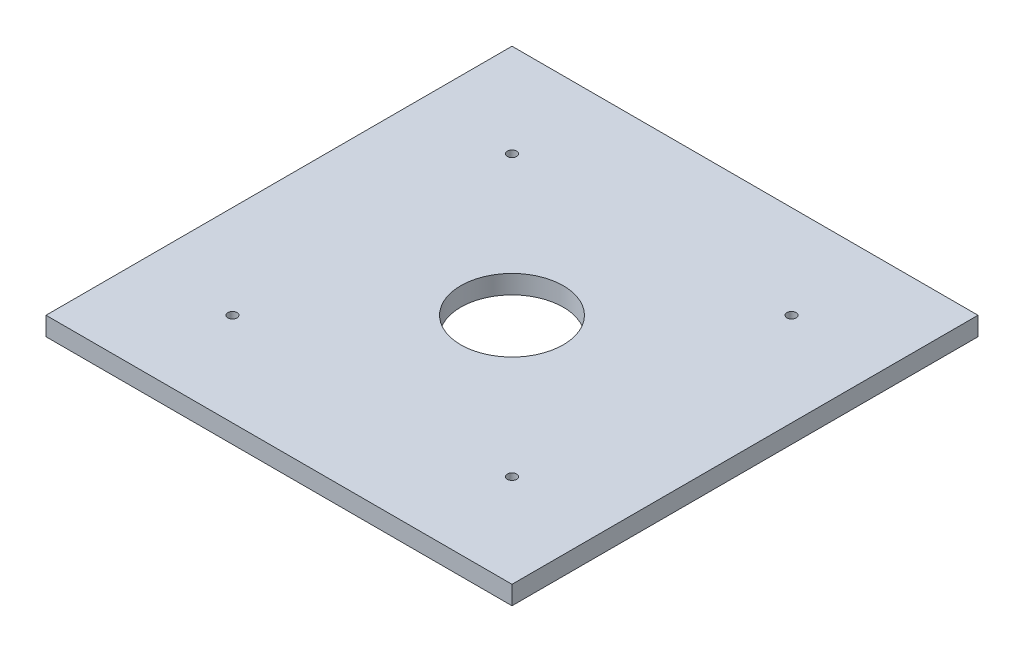
ISO-10303-21;
HEADER;
FILE_DESCRIPTION(('STEP AP214'),'2;1');
FILE_NAME('part.step','',(''),(''),'','','');
FILE_SCHEMA(('AUTOMOTIVE_DESIGN { 1 0 10303 214 1 1 1 1 }'));
ENDSEC;
DATA;
#1=APPLICATION_CONTEXT('core data for automotive mechanical design processes');
#2=APPLICATION_PROTOCOL_DEFINITION('international standard','automotive_design',2000,#1);
#3=PRODUCT_CONTEXT('',#1,'mechanical');
#4=PRODUCT('Part','Part','',(#3));
#5=PRODUCT_RELATED_PRODUCT_CATEGORY('part','',(#4));
#6=PRODUCT_DEFINITION_FORMATION('','',#4);
#7=PRODUCT_DEFINITION_CONTEXT('part definition',#1,'design');
#8=PRODUCT_DEFINITION('design','',#6,#7);
#9=PRODUCT_DEFINITION_SHAPE('','',#8);
#10=(LENGTH_UNIT() NAMED_UNIT(*) SI_UNIT(.MILLI.,.METRE.));
#11=(NAMED_UNIT(*) PLANE_ANGLE_UNIT() SI_UNIT($,.RADIAN.));
#12=(NAMED_UNIT(*) SI_UNIT($,.STERADIAN.) SOLID_ANGLE_UNIT());
#13=UNCERTAINTY_MEASURE_WITH_UNIT(LENGTH_MEASURE(1.E-05),#10,'distance_accuracy_value','');
#14=(GEOMETRIC_REPRESENTATION_CONTEXT(3) GLOBAL_UNCERTAINTY_ASSIGNED_CONTEXT((#13)) GLOBAL_UNIT_ASSIGNED_CONTEXT((#10,
#11,#12)) REPRESENTATION_CONTEXT('',''));
#15=CARTESIAN_POINT('',(0.,0.,0.));
#16=DIRECTION('',(0.,0.,1.));
#17=DIRECTION('',(1.,0.,0.));
#18=AXIS2_PLACEMENT_3D('',#15,#16,#17);
#19=CARTESIAN_POINT('',(0.,10.,0.));
#20=DIRECTION('',(0.,-1.,0.));
#21=DIRECTION('',(0.,0.,-1.));
#22=AXIS2_PLACEMENT_3D('',#19,#20,#21);
#23=PLANE('',#22);
#24=DIRECTION('',(0.,0.,-1.));
#25=VECTOR('',#24,1.);
#26=CARTESIAN_POINT('',(250.,10.,250.));
#27=LINE('',#26,#25);
#28=CARTESIAN_POINT('',(250.,10.,250.));
#29=VERTEX_POINT('',#28);
#30=CARTESIAN_POINT('',(250.,10.,-250.));
#31=VERTEX_POINT('',#30);
#32=EDGE_CURVE('E89',#29,#31,#27,.T.);
#33=ORIENTED_EDGE('',*,*,#32,.T.);
#34=DIRECTION('',(-1.,0.,0.));
#35=VECTOR('',#34,1.);
#36=CARTESIAN_POINT('',(-250.,10.,-250.));
#37=LINE('',#36,#35);
#38=CARTESIAN_POINT('',(-250.,10.,-250.));
#39=VERTEX_POINT('',#38);
#40=EDGE_CURVE('E84',#31,#39,#37,.T.);
#41=ORIENTED_EDGE('',*,*,#40,.T.);
#42=DIRECTION('',(0.,0.,1.));
#43=VECTOR('',#42,1.);
#44=CARTESIAN_POINT('',(-250.,10.,250.));
#45=LINE('',#44,#43);
#46=CARTESIAN_POINT('',(-250.,10.,250.));
#47=VERTEX_POINT('',#46);
#48=EDGE_CURVE('E87',#39,#47,#45,.T.);
#49=ORIENTED_EDGE('',*,*,#48,.T.);
#50=DIRECTION('',(1.,0.,0.));
#51=VECTOR('',#50,1.);
#52=CARTESIAN_POINT('',(-250.,10.,250.));
#53=LINE('',#52,#51);
#54=EDGE_CURVE('E54',#47,#29,#53,.T.);
#55=ORIENTED_EDGE('',*,*,#54,.T.);
#56=EDGE_LOOP('',(#33,#41,#49,#55));
#57=FACE_BOUND('',#56,.T.);
#58=CARTESIAN_POINT('',(-2.22044604925031E-13,10.,0.));
#59=DIRECTION('',(0.,1.,0.));
#60=DIRECTION('',(0.,0.,1.));
#61=AXIS2_PLACEMENT_3D('',#58,#59,#60);
#62=CIRCLE('',#61,55.);
#63=CARTESIAN_POINT('',(-2.22044604925031E-13,10.,54.9999999999999));
#64=VERTEX_POINT('',#63);
#65=EDGE_CURVE('E104',#64,#64,#62,.T.);
#66=ORIENTED_EDGE('',*,*,#65,.F.);
#67=EDGE_LOOP('',(#66));
#68=FACE_BOUND('',#67,.T.);
#69=CARTESIAN_POINT('',(-150.,10.,-150.));
#70=DIRECTION('',(0.,1.,0.));
#71=DIRECTION('',(0.,0.,1.));
#72=AXIS2_PLACEMENT_3D('',#69,#70,#71);
#73=CIRCLE('',#72,4.99999999999999);
#74=CARTESIAN_POINT('',(-150.,10.,-145.));
#75=VERTEX_POINT('',#74);
#76=EDGE_CURVE('E119',#75,#75,#73,.T.);
#77=ORIENTED_EDGE('',*,*,#76,.F.);
#78=EDGE_LOOP('',(#77));
#79=FACE_BOUND('',#78,.T.);
#80=CARTESIAN_POINT('',(150.,10.,-150.));
#81=DIRECTION('',(0.,1.,0.));
#82=DIRECTION('',(0.,0.,1.));
#83=AXIS2_PLACEMENT_3D('',#80,#81,#82);
#84=CIRCLE('',#83,4.99999999999999);
#85=CARTESIAN_POINT('',(150.,10.,-145.));
#86=VERTEX_POINT('',#85);
#87=EDGE_CURVE('E125',#86,#86,#84,.T.);
#88=ORIENTED_EDGE('',*,*,#87,.F.);
#89=EDGE_LOOP('',(#88));
#90=FACE_BOUND('',#89,.T.);
#91=CARTESIAN_POINT('',(-150.,10.,150.));
#92=DIRECTION('',(0.,1.,0.));
#93=DIRECTION('',(0.,0.,1.));
#94=AXIS2_PLACEMENT_3D('',#91,#92,#93);
#95=CIRCLE('',#94,4.99999999999999);
#96=CARTESIAN_POINT('',(-150.,10.,155.));
#97=VERTEX_POINT('',#96);
#98=EDGE_CURVE('E131',#97,#97,#95,.T.);
#99=ORIENTED_EDGE('',*,*,#98,.F.);
#100=EDGE_LOOP('',(#99));
#101=FACE_BOUND('',#100,.T.);
#102=CARTESIAN_POINT('',(150.,10.,150.));
#103=DIRECTION('',(0.,1.,0.));
#104=DIRECTION('',(0.,0.,1.));
#105=AXIS2_PLACEMENT_3D('',#102,#103,#104);
#106=CIRCLE('',#105,4.99999999999999);
#107=CARTESIAN_POINT('',(150.,10.,155.));
#108=VERTEX_POINT('',#107);
#109=EDGE_CURVE('E137',#108,#108,#106,.T.);
#110=ORIENTED_EDGE('',*,*,#109,.F.);
#111=EDGE_LOOP('',(#110));
#112=FACE_BOUND('',#111,.T.);
#113=ADVANCED_FACE('F37',(#57,#68,#79,#90,#101,#112),#23,.F.);
#114=CARTESIAN_POINT('',(0.,-10.,0.));
#115=DIRECTION('',(0.,-1.,0.));
#116=DIRECTION('',(0.,0.,-1.));
#117=AXIS2_PLACEMENT_3D('',#114,#115,#116);
#118=PLANE('',#117);
#119=CARTESIAN_POINT('',(-150.,-10.,150.));
#120=DIRECTION('',(0.,1.,0.));
#121=DIRECTION('',(0.,0.,1.));
#122=AXIS2_PLACEMENT_3D('',#119,#120,#121);
#123=CIRCLE('',#122,4.99999999999999);
#124=CARTESIAN_POINT('',(-150.,-10.,155.));
#125=VERTEX_POINT('',#124);
#126=EDGE_CURVE('E134',#125,#125,#123,.T.);
#127=ORIENTED_EDGE('',*,*,#126,.T.);
#128=EDGE_LOOP('',(#127));
#129=FACE_BOUND('',#128,.T.);
#130=CARTESIAN_POINT('',(-150.,-10.,-150.));
#131=DIRECTION('',(0.,1.,0.));
#132=DIRECTION('',(0.,0.,1.));
#133=AXIS2_PLACEMENT_3D('',#130,#131,#132);
#134=CIRCLE('',#133,4.99999999999999);
#135=CARTESIAN_POINT('',(-150.,-10.,-145.));
#136=VERTEX_POINT('',#135);
#137=EDGE_CURVE('E122',#136,#136,#134,.T.);
#138=ORIENTED_EDGE('',*,*,#137,.T.);
#139=EDGE_LOOP('',(#138));
#140=FACE_BOUND('',#139,.T.);
#141=DIRECTION('',(0.,0.,-1.));
#142=VECTOR('',#141,1.);
#143=CARTESIAN_POINT('',(250.,-10.,250.));
#144=LINE('',#143,#142);
#145=CARTESIAN_POINT('',(250.,-10.,250.));
#146=VERTEX_POINT('',#145);
#147=CARTESIAN_POINT('',(250.,-10.,-250.));
#148=VERTEX_POINT('',#147);
#149=EDGE_CURVE('E101',#146,#148,#144,.T.);
#150=ORIENTED_EDGE('',*,*,#149,.F.);
#151=DIRECTION('',(1.,0.,0.));
#152=VECTOR('',#151,1.);
#153=CARTESIAN_POINT('',(-250.,-10.,250.));
#154=LINE('',#153,#152);
#155=CARTESIAN_POINT('',(-250.,-10.,250.));
#156=VERTEX_POINT('',#155);
#157=EDGE_CURVE('E77',#156,#146,#154,.T.);
#158=ORIENTED_EDGE('',*,*,#157,.F.);
#159=DIRECTION('',(0.,0.,1.));
#160=VECTOR('',#159,1.);
#161=CARTESIAN_POINT('',(-250.,-10.,250.));
#162=LINE('',#161,#160);
#163=CARTESIAN_POINT('',(-250.,-10.,-250.));
#164=VERTEX_POINT('',#163);
#165=EDGE_CURVE('E71',#164,#156,#162,.T.);
#166=ORIENTED_EDGE('',*,*,#165,.F.);
#167=DIRECTION('',(-1.,0.,0.));
#168=VECTOR('',#167,1.);
#169=CARTESIAN_POINT('',(-250.,-10.,-250.));
#170=LINE('',#169,#168);
#171=EDGE_CURVE('E93',#148,#164,#170,.T.);
#172=ORIENTED_EDGE('',*,*,#171,.F.);
#173=EDGE_LOOP('',(#150,#158,#166,#172));
#174=FACE_BOUND('',#173,.T.);
#175=CARTESIAN_POINT('',(-2.22044604925031E-13,-10.,0.));
#176=DIRECTION('',(0.,1.,0.));
#177=DIRECTION('',(0.,0.,1.));
#178=AXIS2_PLACEMENT_3D('',#175,#176,#177);
#179=CIRCLE('',#178,55.);
#180=CARTESIAN_POINT('',(-2.22044604925031E-13,-10.,54.9999999999999));
#181=VERTEX_POINT('',#180);
#182=EDGE_CURVE('E116',#181,#181,#179,.T.);
#183=ORIENTED_EDGE('',*,*,#182,.T.);
#184=EDGE_LOOP('',(#183));
#185=FACE_BOUND('',#184,.T.);
#186=CARTESIAN_POINT('',(150.,-10.,-150.));
#187=DIRECTION('',(0.,1.,0.));
#188=DIRECTION('',(0.,0.,1.));
#189=AXIS2_PLACEMENT_3D('',#186,#187,#188);
#190=CIRCLE('',#189,4.99999999999999);
#191=CARTESIAN_POINT('',(150.,-10.,-145.));
#192=VERTEX_POINT('',#191);
#193=EDGE_CURVE('E128',#192,#192,#190,.T.);
#194=ORIENTED_EDGE('',*,*,#193,.T.);
#195=EDGE_LOOP('',(#194));
#196=FACE_BOUND('',#195,.T.);
#197=CARTESIAN_POINT('',(150.,-10.,150.));
#198=DIRECTION('',(0.,1.,0.));
#199=DIRECTION('',(0.,0.,1.));
#200=AXIS2_PLACEMENT_3D('',#197,#198,#199);
#201=CIRCLE('',#200,4.99999999999999);
#202=CARTESIAN_POINT('',(150.,-10.,155.));
#203=VERTEX_POINT('',#202);
#204=EDGE_CURVE('E140',#203,#203,#201,.T.);
#205=ORIENTED_EDGE('',*,*,#204,.T.);
#206=EDGE_LOOP('',(#205));
#207=FACE_BOUND('',#206,.T.);
#208=ADVANCED_FACE('F112',(#129,#140,#174,#185,#196,#207),#118,.T.);
#209=CARTESIAN_POINT('',(250.,10.,250.));
#210=DIRECTION('',(-1.,0.,0.));
#211=DIRECTION('',(0.,0.,1.));
#212=AXIS2_PLACEMENT_3D('',#209,#210,#211);
#213=PLANE('',#212);
#214=ORIENTED_EDGE('',*,*,#149,.T.);
#215=DIRECTION('',(0.,-1.,0.));
#216=VECTOR('',#215,1.);
#217=CARTESIAN_POINT('',(250.,10.,-250.));
#218=LINE('',#217,#216);
#219=EDGE_CURVE('E11',#31,#148,#218,.T.);
#220=ORIENTED_EDGE('',*,*,#219,.F.);
#221=ORIENTED_EDGE('',*,*,#32,.F.);
#222=DIRECTION('',(0.,-1.,0.));
#223=VECTOR('',#222,1.);
#224=CARTESIAN_POINT('',(250.,10.,250.));
#225=LINE('',#224,#223);
#226=EDGE_CURVE('E97',#29,#146,#225,.T.);
#227=ORIENTED_EDGE('',*,*,#226,.T.);
#228=EDGE_LOOP('',(#214,#220,#221,#227));
#229=FACE_BOUND('',#228,.T.);
#230=ADVANCED_FACE('F39',(#229),#213,.F.);
#231=CARTESIAN_POINT('',(-250.,10.,-250.));
#232=DIRECTION('',(0.,0.,1.));
#233=DIRECTION('',(1.,0.,0.));
#234=AXIS2_PLACEMENT_3D('',#231,#232,#233);
#235=PLANE('',#234);
#236=ORIENTED_EDGE('',*,*,#171,.T.);
#237=DIRECTION('',(0.,-1.,0.));
#238=VECTOR('',#237,1.);
#239=CARTESIAN_POINT('',(-250.,10.,-250.));
#240=LINE('',#239,#238);
#241=EDGE_CURVE('E46',#39,#164,#240,.T.);
#242=ORIENTED_EDGE('',*,*,#241,.F.);
#243=ORIENTED_EDGE('',*,*,#40,.F.);
#244=ORIENTED_EDGE('',*,*,#219,.T.);
#245=EDGE_LOOP('',(#236,#242,#243,#244));
#246=FACE_BOUND('',#245,.T.);
#247=ADVANCED_FACE('F92',(#246),#235,.F.);
#248=CARTESIAN_POINT('',(-250.,10.,250.));
#249=DIRECTION('',(1.,0.,0.));
#250=DIRECTION('',(0.,0.,-1.));
#251=AXIS2_PLACEMENT_3D('',#248,#249,#250);
#252=PLANE('',#251);
#253=ORIENTED_EDGE('',*,*,#165,.T.);
#254=DIRECTION('',(0.,-1.,0.));
#255=VECTOR('',#254,1.);
#256=CARTESIAN_POINT('',(-250.,10.,250.));
#257=LINE('',#256,#255);
#258=EDGE_CURVE('E94',#47,#156,#257,.T.);
#259=ORIENTED_EDGE('',*,*,#258,.F.);
#260=ORIENTED_EDGE('',*,*,#48,.F.);
#261=ORIENTED_EDGE('',*,*,#241,.T.);
#262=EDGE_LOOP('',(#253,#259,#260,#261));
#263=FACE_BOUND('',#262,.T.);
#264=ADVANCED_FACE('F95',(#263),#252,.F.);
#265=CARTESIAN_POINT('',(-250.,10.,250.));
#266=DIRECTION('',(0.,0.,-1.));
#267=DIRECTION('',(-1.,0.,0.));
#268=AXIS2_PLACEMENT_3D('',#265,#266,#267);
#269=PLANE('',#268);
#270=ORIENTED_EDGE('',*,*,#157,.T.);
#271=ORIENTED_EDGE('',*,*,#226,.F.);
#272=ORIENTED_EDGE('',*,*,#54,.F.);
#273=ORIENTED_EDGE('',*,*,#258,.T.);
#274=EDGE_LOOP('',(#270,#271,#272,#273));
#275=FACE_BOUND('',#274,.T.);
#276=ADVANCED_FACE('F109',(#275),#269,.F.);
#277=CARTESIAN_POINT('',(-2.22044604925031E-13,10.,0.));
#278=DIRECTION('',(0.,-1.,0.));
#279=DIRECTION('',(0.,0.,-1.));
#280=AXIS2_PLACEMENT_3D('',#277,#278,#279);
#281=CYLINDRICAL_SURFACE('',#280,55.);
#282=ORIENTED_EDGE('',*,*,#65,.T.);
#283=EDGE_LOOP('',(#282));
#284=FACE_BOUND('',#283,.T.);
#285=ORIENTED_EDGE('',*,*,#182,.F.);
#286=EDGE_LOOP('',(#285));
#287=FACE_BOUND('',#286,.T.);
#288=ADVANCED_FACE('F157',(#284,#287),#281,.F.);
#289=CARTESIAN_POINT('',(-150.,10.,-150.));
#290=DIRECTION('',(0.,-1.,0.));
#291=DIRECTION('',(0.,0.,-1.));
#292=AXIS2_PLACEMENT_3D('',#289,#290,#291);
#293=CYLINDRICAL_SURFACE('',#292,4.99999999999999);
#294=ORIENTED_EDGE('',*,*,#76,.T.);
#295=EDGE_LOOP('',(#294));
#296=FACE_BOUND('',#295,.T.);
#297=ORIENTED_EDGE('',*,*,#137,.F.);
#298=EDGE_LOOP('',(#297));
#299=FACE_BOUND('',#298,.T.);
#300=ADVANCED_FACE('F211',(#296,#299),#293,.F.);
#301=CARTESIAN_POINT('',(150.,10.,-150.));
#302=DIRECTION('',(0.,-1.,0.));
#303=DIRECTION('',(0.,0.,-1.));
#304=AXIS2_PLACEMENT_3D('',#301,#302,#303);
#305=CYLINDRICAL_SURFACE('',#304,4.99999999999999);
#306=ORIENTED_EDGE('',*,*,#87,.T.);
#307=EDGE_LOOP('',(#306));
#308=FACE_BOUND('',#307,.T.);
#309=ORIENTED_EDGE('',*,*,#193,.F.);
#310=EDGE_LOOP('',(#309));
#311=FACE_BOUND('',#310,.T.);
#312=ADVANCED_FACE('F220',(#308,#311),#305,.F.);
#313=CARTESIAN_POINT('',(-150.,10.,150.));
#314=DIRECTION('',(0.,-1.,0.));
#315=DIRECTION('',(0.,0.,-1.));
#316=AXIS2_PLACEMENT_3D('',#313,#314,#315);
#317=CYLINDRICAL_SURFACE('',#316,4.99999999999999);
#318=ORIENTED_EDGE('',*,*,#98,.T.);
#319=EDGE_LOOP('',(#318));
#320=FACE_BOUND('',#319,.T.);
#321=ORIENTED_EDGE('',*,*,#126,.F.);
#322=EDGE_LOOP('',(#321));
#323=FACE_BOUND('',#322,.T.);
#324=ADVANCED_FACE('F229',(#320,#323),#317,.F.);
#325=CARTESIAN_POINT('',(150.,10.,150.));
#326=DIRECTION('',(0.,-1.,0.));
#327=DIRECTION('',(0.,0.,-1.));
#328=AXIS2_PLACEMENT_3D('',#325,#326,#327);
#329=CYLINDRICAL_SURFACE('',#328,4.99999999999999);
#330=ORIENTED_EDGE('',*,*,#109,.T.);
#331=EDGE_LOOP('',(#330));
#332=FACE_BOUND('',#331,.T.);
#333=ORIENTED_EDGE('',*,*,#204,.F.);
#334=EDGE_LOOP('',(#333));
#335=FACE_BOUND('',#334,.T.);
#336=ADVANCED_FACE('F146',(#332,#335),#329,.F.);
#337=CLOSED_SHELL('',(#113,#208,#230,#247,#264,#276,#288,#300,#312,#324,#336));
#338=MANIFOLD_SOLID_BREP('B2',#337);
#339=ADVANCED_BREP_SHAPE_REPRESENTATION('',(#18,#338),#14);
#340=SHAPE_DEFINITION_REPRESENTATION(#9,#339);
ENDSEC;
END-ISO-10303-21;
